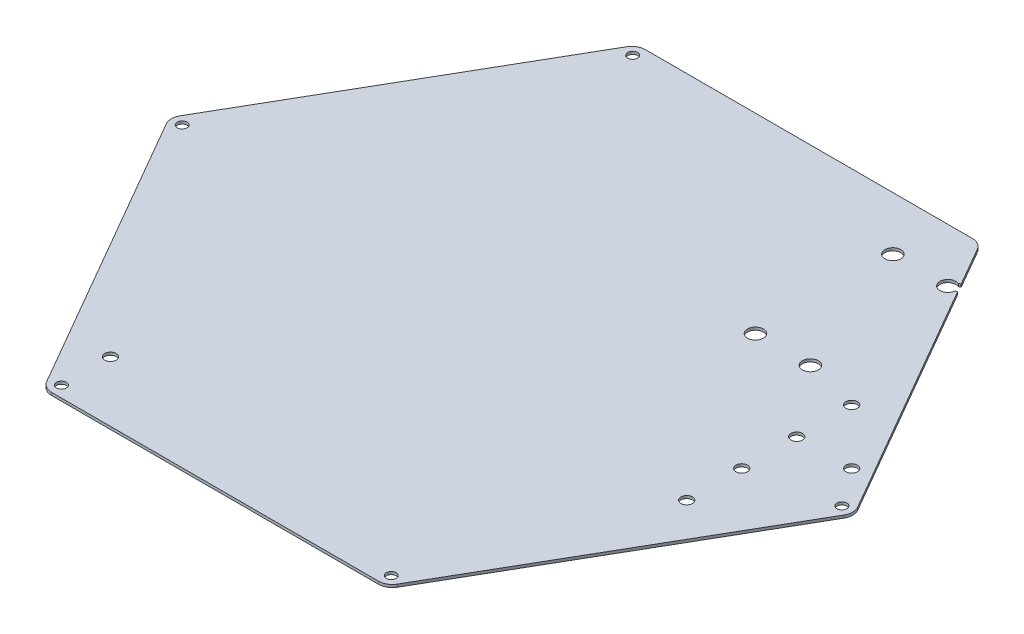
ISO-10303-21;
HEADER;
FILE_DESCRIPTION(('STEP AP214'),'2;1');
FILE_NAME('part.step','',(''),(''),'','','');
FILE_SCHEMA(('AUTOMOTIVE_DESIGN { 1 0 10303 214 1 1 1 1 }'));
ENDSEC;
DATA;
#1=APPLICATION_CONTEXT('core data for automotive mechanical design processes');
#2=APPLICATION_PROTOCOL_DEFINITION('international standard','automotive_design',2000,#1);
#3=PRODUCT_CONTEXT('',#1,'mechanical');
#4=PRODUCT('Part','Part','',(#3));
#5=PRODUCT_RELATED_PRODUCT_CATEGORY('part','',(#4));
#6=PRODUCT_DEFINITION_FORMATION('','',#4);
#7=PRODUCT_DEFINITION_CONTEXT('part definition',#1,'design');
#8=PRODUCT_DEFINITION('design','',#6,#7);
#9=PRODUCT_DEFINITION_SHAPE('','',#8);
#10=(LENGTH_UNIT() NAMED_UNIT(*) SI_UNIT(.MILLI.,.METRE.));
#11=(NAMED_UNIT(*) PLANE_ANGLE_UNIT() SI_UNIT($,.RADIAN.));
#12=(NAMED_UNIT(*) SI_UNIT($,.STERADIAN.) SOLID_ANGLE_UNIT());
#13=UNCERTAINTY_MEASURE_WITH_UNIT(LENGTH_MEASURE(1.E-05),#10,'distance_accuracy_value','');
#14=(GEOMETRIC_REPRESENTATION_CONTEXT(3) GLOBAL_UNCERTAINTY_ASSIGNED_CONTEXT((#13)) GLOBAL_UNIT_ASSIGNED_CONTEXT((#10,
#11,#12)) REPRESENTATION_CONTEXT('',''));
#15=CARTESIAN_POINT('',(0.,0.,0.));
#16=DIRECTION('',(0.,0.,1.));
#17=DIRECTION('',(1.,0.,0.));
#18=AXIS2_PLACEMENT_3D('',#15,#16,#17);
#19=CARTESIAN_POINT('',(249.415316289918,1.,-108.));
#20=DIRECTION('',(-0.866025403784439,0.,0.5));
#21=DIRECTION('',(0.5,0.,0.866025403784439));
#22=AXIS2_PLACEMENT_3D('',#19,#20,#21);
#23=PLANE('',#22);
#24=DIRECTION('',(-0.5,0.,-0.866025403784439));
#25=VECTOR('',#24,1.);
#26=CARTESIAN_POINT('',(249.415316289918,1.,-108.));
#27=LINE('',#26,#25);
#28=CARTESIAN_POINT('',(196.511466747085,1.,-199.632155324167));
#29=VERTEX_POINT('',#28);
#30=CARTESIAN_POINT('',(188.504862890413,1.,-213.5));
#31=VERTEX_POINT('',#30);
#32=EDGE_CURVE('E287',#29,#31,#27,.T.);
#33=ORIENTED_EDGE('',*,*,#32,.F.);
#34=DIRECTION('',(0.,1.,0.));
#35=VECTOR('',#34,1.);
#36=CARTESIAN_POINT('',(196.511466747085,0.,-199.632155324167));
#37=LINE('',#36,#35);
#38=CARTESIAN_POINT('',(196.511466747085,0.,-199.632155324167));
#39=VERTEX_POINT('',#38);
#40=EDGE_CURVE('E173',#39,#29,#37,.T.);
#41=ORIENTED_EDGE('',*,*,#40,.F.);
#42=DIRECTION('',(-0.5,0.,-0.866025403784439));
#43=VECTOR('',#42,1.);
#44=CARTESIAN_POINT('',(249.415316289918,0.,-108.));
#45=LINE('',#44,#43);
#46=CARTESIAN_POINT('',(188.504862890413,0.,-213.5));
#47=VERTEX_POINT('',#46);
#48=EDGE_CURVE('E195',#39,#47,#45,.T.);
#49=ORIENTED_EDGE('',*,*,#48,.T.);
#50=DIRECTION('',(0.,-1.,0.));
#51=VECTOR('',#50,1.);
#52=CARTESIAN_POINT('',(188.504862890413,1.,-213.5));
#53=LINE('',#52,#51);
#54=EDGE_CURVE('E251',#47,#31,#53,.F.);
#55=ORIENTED_EDGE('',*,*,#54,.T.);
#56=EDGE_LOOP('',(#33,#41,#49,#55));
#57=FACE_BOUND('',#56,.T.);
#58=ADVANCED_FACE('F43',(#57),#23,.F.);
#59=CARTESIAN_POINT('',(0.,1.,-108.));
#60=DIRECTION('',(0.866025403784439,0.,-0.5));
#61=DIRECTION('',(-0.5,0.,-0.866025403784439));
#62=AXIS2_PLACEMENT_3D('',#59,#60,#61);
#63=PLANE('',#62);
#64=DIRECTION('',(0.5,0.,0.866025403784439));
#65=VECTOR('',#64,1.);
#66=CARTESIAN_POINT('',(0.,1.,-108.));
#67=LINE('',#66,#65);
#68=CARTESIAN_POINT('',(1.44337567297407,1.,-105.5));
#69=VERTEX_POINT('',#68);
#70=CARTESIAN_POINT('',(60.9104533995055,1.,-2.50000000000002));
#71=VERTEX_POINT('',#70);
#72=EDGE_CURVE('E208',#69,#71,#67,.T.);
#73=ORIENTED_EDGE('',*,*,#72,.F.);
#74=DIRECTION('',(0.,-1.,0.));
#75=VECTOR('',#74,1.);
#76=CARTESIAN_POINT('',(1.44337567297407,1.,-105.5));
#77=LINE('',#76,#75);
#78=CARTESIAN_POINT('',(1.44337567297407,0.,-105.5));
#79=VERTEX_POINT('',#78);
#80=EDGE_CURVE('E211',#69,#79,#77,.T.);
#81=ORIENTED_EDGE('',*,*,#80,.T.);
#82=DIRECTION('',(0.5,0.,0.866025403784439));
#83=VECTOR('',#82,1.);
#84=CARTESIAN_POINT('',(0.,0.,-108.));
#85=LINE('',#84,#83);
#86=CARTESIAN_POINT('',(60.9104533995055,0.,-2.50000000000002));
#87=VERTEX_POINT('',#86);
#88=EDGE_CURVE('E262',#79,#87,#85,.T.);
#89=ORIENTED_EDGE('',*,*,#88,.T.);
#90=DIRECTION('',(0.,-1.,0.));
#91=VECTOR('',#90,1.);
#92=CARTESIAN_POINT('',(60.9104533995055,1.,-2.49999999999997));
#93=LINE('',#92,#91);
#94=EDGE_CURVE('E209',#87,#71,#93,.F.);
#95=ORIENTED_EDGE('',*,*,#94,.T.);
#96=EDGE_LOOP('',(#73,#81,#89,#95));
#97=FACE_BOUND('',#96,.T.);
#98=ADVANCED_FACE('F323',(#97),#63,.F.);
#99=CARTESIAN_POINT('',(62.3538290724796,1.,0.));
#100=DIRECTION('',(0.,0.,-1.));
#101=DIRECTION('',(-1.,0.,0.));
#102=AXIS2_PLACEMENT_3D('',#99,#100,#101);
#103=PLANE('',#102);
#104=DIRECTION('',(1.,0.,0.));
#105=VECTOR('',#104,1.);
#106=CARTESIAN_POINT('',(62.3538290724796,1.,0.));
#107=LINE('',#106,#105);
#108=CARTESIAN_POINT('',(65.2405804184277,1.,0.));
#109=VERTEX_POINT('',#108);
#110=CARTESIAN_POINT('',(184.174735871491,1.,0.));
#111=VERTEX_POINT('',#110);
#112=EDGE_CURVE('E281',#109,#111,#107,.T.);
#113=ORIENTED_EDGE('',*,*,#112,.F.);
#114=DIRECTION('',(0.,-1.,0.));
#115=VECTOR('',#114,1.);
#116=CARTESIAN_POINT('',(65.2405804184277,1.,0.));
#117=LINE('',#116,#115);
#118=CARTESIAN_POINT('',(65.2405804184277,0.,0.));
#119=VERTEX_POINT('',#118);
#120=EDGE_CURVE('E11',#109,#119,#117,.T.);
#121=ORIENTED_EDGE('',*,*,#120,.T.);
#122=DIRECTION('',(1.,0.,0.));
#123=VECTOR('',#122,1.);
#124=CARTESIAN_POINT('',(62.3538290724796,0.,0.));
#125=LINE('',#124,#123);
#126=CARTESIAN_POINT('',(184.174735871491,0.,0.));
#127=VERTEX_POINT('',#126);
#128=EDGE_CURVE('E297',#119,#127,#125,.T.);
#129=ORIENTED_EDGE('',*,*,#128,.T.);
#130=DIRECTION('',(0.,-1.,0.));
#131=VECTOR('',#130,1.);
#132=CARTESIAN_POINT('',(184.174735871491,1.,0.));
#133=LINE('',#132,#131);
#134=EDGE_CURVE('E52',#127,#111,#133,.F.);
#135=ORIENTED_EDGE('',*,*,#134,.T.);
#136=EDGE_LOOP('',(#113,#121,#129,#135));
#137=FACE_BOUND('',#136,.T.);
#138=ADVANCED_FACE('F328',(#137),#103,.F.);
#139=CARTESIAN_POINT('',(187.061487217439,1.,0.));
#140=DIRECTION('',(-0.866025403784439,0.,-0.5));
#141=DIRECTION('',(-0.5,0.,0.866025403784439));
#142=AXIS2_PLACEMENT_3D('',#139,#140,#141);
#143=PLANE('',#142);
#144=DIRECTION('',(0.5,0.,-0.866025403784439));
#145=VECTOR('',#144,1.);
#146=CARTESIAN_POINT('',(187.061487217439,0.,0.));
#147=LINE('',#146,#145);
#148=CARTESIAN_POINT('',(188.504862890413,0.,-2.5));
#149=VERTEX_POINT('',#148);
#150=CARTESIAN_POINT('',(247.971940616944,0.,-105.5));
#151=VERTEX_POINT('',#150);
#152=EDGE_CURVE('E202',#149,#151,#147,.T.);
#153=ORIENTED_EDGE('',*,*,#152,.T.);
#154=DIRECTION('',(0.,-1.,0.));
#155=VECTOR('',#154,1.);
#156=CARTESIAN_POINT('',(247.971940616944,1.,-105.5));
#157=LINE('',#156,#155);
#158=CARTESIAN_POINT('',(247.971940616944,1.,-105.5));
#159=VERTEX_POINT('',#158);
#160=EDGE_CURVE('E257',#151,#159,#157,.F.);
#161=ORIENTED_EDGE('',*,*,#160,.T.);
#162=DIRECTION('',(0.5,0.,-0.866025403784439));
#163=VECTOR('',#162,1.);
#164=CARTESIAN_POINT('',(187.061487217439,1.,0.));
#165=LINE('',#164,#163);
#166=CARTESIAN_POINT('',(188.504862890413,1.,-2.5));
#167=VERTEX_POINT('',#166);
#168=EDGE_CURVE('E284',#167,#159,#165,.T.);
#169=ORIENTED_EDGE('',*,*,#168,.F.);
#170=DIRECTION('',(0.,-1.,0.));
#171=VECTOR('',#170,1.);
#172=CARTESIAN_POINT('',(188.504862890413,1.,-2.5));
#173=LINE('',#172,#171);
#174=EDGE_CURVE('E254',#167,#149,#173,.T.);
#175=ORIENTED_EDGE('',*,*,#174,.T.);
#176=EDGE_LOOP('',(#153,#161,#169,#175));
#177=FACE_BOUND('',#176,.T.);
#178=ADVANCED_FACE('F306',(#177),#143,.F.);
#179=CARTESIAN_POINT('',(247.971940616944,0.,-110.5));
#180=VERTEX_POINT('',#179);
#181=CARTESIAN_POINT('',(198.261466747085,0.,-196.601066410922));
#182=VERTEX_POINT('',#181);
#183=EDGE_CURVE('E182',#180,#182,#45,.T.);
#184=ORIENTED_EDGE('',*,*,#183,.T.);
#185=DIRECTION('',(0.,1.,0.));
#186=VECTOR('',#185,1.);
#187=CARTESIAN_POINT('',(198.261466747085,0.,-196.601066410922));
#188=LINE('',#187,#186);
#189=CARTESIAN_POINT('',(198.261466747085,1.,-196.601066410922));
#190=VERTEX_POINT('',#189);
#191=EDGE_CURVE('E164',#182,#190,#188,.T.);
#192=ORIENTED_EDGE('',*,*,#191,.T.);
#193=CARTESIAN_POINT('',(247.971940616944,1.,-110.5));
#194=VERTEX_POINT('',#193);
#195=EDGE_CURVE('E288',#194,#190,#27,.T.);
#196=ORIENTED_EDGE('',*,*,#195,.F.);
#197=DIRECTION('',(0.,-1.,0.));
#198=VECTOR('',#197,1.);
#199=CARTESIAN_POINT('',(247.971940616944,1.,-110.5));
#200=LINE('',#199,#198);
#201=EDGE_CURVE('E192',#194,#180,#200,.T.);
#202=ORIENTED_EDGE('',*,*,#201,.T.);
#203=EDGE_LOOP('',(#184,#192,#196,#202));
#204=FACE_BOUND('',#203,.T.);
#205=ADVANCED_FACE('F190',(#204),#23,.F.);
#206=CARTESIAN_POINT('',(187.061487217439,1.,-216.));
#207=DIRECTION('',(0.,0.,1.));
#208=DIRECTION('',(1.,0.,0.));
#209=AXIS2_PLACEMENT_3D('',#206,#207,#208);
#210=PLANE('',#209);
#211=DIRECTION('',(-1.,0.,0.));
#212=VECTOR('',#211,1.);
#213=CARTESIAN_POINT('',(187.061487217439,0.,-216.));
#214=LINE('',#213,#212);
#215=CARTESIAN_POINT('',(184.174735871491,0.,-216.));
#216=VERTEX_POINT('',#215);
#217=CARTESIAN_POINT('',(65.2405804184277,0.,-216.));
#218=VERTEX_POINT('',#217);
#219=EDGE_CURVE('E194',#216,#218,#214,.T.);
#220=ORIENTED_EDGE('',*,*,#219,.T.);
#221=DIRECTION('',(0.,-1.,0.));
#222=VECTOR('',#221,1.);
#223=CARTESIAN_POINT('',(65.2405804184277,1.,-216.));
#224=LINE('',#223,#222);
#225=CARTESIAN_POINT('',(65.2405804184277,1.,-216.));
#226=VERTEX_POINT('',#225);
#227=EDGE_CURVE('E248',#218,#226,#224,.F.);
#228=ORIENTED_EDGE('',*,*,#227,.T.);
#229=DIRECTION('',(-1.,0.,0.));
#230=VECTOR('',#229,1.);
#231=CARTESIAN_POINT('',(187.061487217439,1.,-216.));
#232=LINE('',#231,#230);
#233=CARTESIAN_POINT('',(184.174735871491,1.,-216.));
#234=VERTEX_POINT('',#233);
#235=EDGE_CURVE('E291',#234,#226,#232,.T.);
#236=ORIENTED_EDGE('',*,*,#235,.F.);
#237=DIRECTION('',(0.,-1.,0.));
#238=VECTOR('',#237,1.);
#239=CARTESIAN_POINT('',(184.174735871491,1.,-216.));
#240=LINE('',#239,#238);
#241=EDGE_CURVE('E245',#234,#216,#240,.T.);
#242=ORIENTED_EDGE('',*,*,#241,.T.);
#243=EDGE_LOOP('',(#220,#228,#236,#242));
#244=FACE_BOUND('',#243,.T.);
#245=ADVANCED_FACE('F345',(#244),#210,.F.);
#246=CARTESIAN_POINT('',(62.3538290724795,1.,-216.));
#247=DIRECTION('',(0.866025403784439,0.,0.5));
#248=DIRECTION('',(0.5,0.,-0.866025403784439));
#249=AXIS2_PLACEMENT_3D('',#246,#247,#248);
#250=PLANE('',#249);
#251=DIRECTION('',(-0.5,0.,0.866025403784439));
#252=VECTOR('',#251,1.);
#253=CARTESIAN_POINT('',(62.3538290724795,0.,-216.));
#254=LINE('',#253,#252);
#255=CARTESIAN_POINT('',(60.9104533995055,0.,-213.5));
#256=VERTEX_POINT('',#255);
#257=CARTESIAN_POINT('',(1.44337567297408,0.,-110.5));
#258=VERTEX_POINT('',#257);
#259=EDGE_CURVE('E199',#256,#258,#254,.T.);
#260=ORIENTED_EDGE('',*,*,#259,.T.);
#261=DIRECTION('',(0.,-1.,0.));
#262=VECTOR('',#261,1.);
#263=CARTESIAN_POINT('',(1.44337567297408,1.,-110.5));
#264=LINE('',#263,#262);
#265=CARTESIAN_POINT('',(1.44337567297408,1.,-110.5));
#266=VERTEX_POINT('',#265);
#267=EDGE_CURVE('E231',#258,#266,#264,.F.);
#268=ORIENTED_EDGE('',*,*,#267,.T.);
#269=DIRECTION('',(-0.5,0.,0.866025403784439));
#270=VECTOR('',#269,1.);
#271=CARTESIAN_POINT('',(62.3538290724795,1.,-216.));
#272=LINE('',#271,#270);
#273=CARTESIAN_POINT('',(60.9104533995055,1.,-213.5));
#274=VERTEX_POINT('',#273);
#275=EDGE_CURVE('E212',#274,#266,#272,.T.);
#276=ORIENTED_EDGE('',*,*,#275,.F.);
#277=DIRECTION('',(0.,-1.,0.));
#278=VECTOR('',#277,1.);
#279=CARTESIAN_POINT('',(60.9104533995055,1.,-213.5));
#280=LINE('',#279,#278);
#281=EDGE_CURVE('E228',#274,#256,#280,.T.);
#282=ORIENTED_EDGE('',*,*,#281,.T.);
#283=EDGE_LOOP('',(#260,#268,#276,#282));
#284=FACE_BOUND('',#283,.T.);
#285=ADVANCED_FACE('F349',(#284),#250,.F.);
#286=CARTESIAN_POINT('',(0.,1.,0.));
#287=DIRECTION('',(0.,1.,0.));
#288=DIRECTION('',(0.,0.,1.));
#289=AXIS2_PLACEMENT_3D('',#286,#287,#288);
#290=PLANE('',#289);
#291=CARTESIAN_POINT('',(234.707658144959,1.,-121.57));
#292=DIRECTION('',(0.,1.,0.));
#293=DIRECTION('',(0.,0.,1.));
#294=AXIS2_PLACEMENT_3D('',#291,#292,#293);
#295=CIRCLE('',#294,2.10000000000002);
#296=CARTESIAN_POINT('',(234.707658144959,1.,-119.47));
#297=VERTEX_POINT('',#296);
#298=EDGE_CURVE('E435',#297,#297,#295,.T.);
#299=ORIENTED_EDGE('',*,*,#298,.F.);
#300=EDGE_LOOP('',(#299));
#301=FACE_BOUND('',#300,.T.);
#302=CARTESIAN_POINT('',(214.707658144959,1.,-81.57));
#303=DIRECTION('',(0.,1.,0.));
#304=DIRECTION('',(0.,0.,1.));
#305=AXIS2_PLACEMENT_3D('',#302,#303,#304);
#306=CIRCLE('',#305,2.10000000000002);
#307=CARTESIAN_POINT('',(214.707658144959,1.,-79.47));
#308=VERTEX_POINT('',#307);
#309=EDGE_CURVE('E437',#308,#308,#306,.T.);
#310=ORIENTED_EDGE('',*,*,#309,.F.);
#311=EDGE_LOOP('',(#310));
#312=FACE_BOUND('',#311,.T.);
#313=CARTESIAN_POINT('',(214.707658144959,1.,-101.57));
#314=DIRECTION('',(0.,1.,0.));
#315=DIRECTION('',(0.,0.,1.));
#316=AXIS2_PLACEMENT_3D('',#313,#314,#315);
#317=CIRCLE('',#316,2.09999999999999);
#318=CARTESIAN_POINT('',(214.707658144959,1.,-99.47));
#319=VERTEX_POINT('',#318);
#320=EDGE_CURVE('E443',#319,#319,#317,.T.);
#321=ORIENTED_EDGE('',*,*,#320,.F.);
#322=EDGE_LOOP('',(#321));
#323=FACE_BOUND('',#322,.T.);
#324=CARTESIAN_POINT('',(214.707658144959,1.,-121.57));
#325=DIRECTION('',(0.,1.,0.));
#326=DIRECTION('',(0.,0.,1.));
#327=AXIS2_PLACEMENT_3D('',#324,#325,#326);
#328=CIRCLE('',#327,2.09999999999999);
#329=CARTESIAN_POINT('',(214.707658144959,1.,-119.47));
#330=VERTEX_POINT('',#329);
#331=EDGE_CURVE('E449',#330,#330,#328,.T.);
#332=ORIENTED_EDGE('',*,*,#331,.F.);
#333=EDGE_LOOP('',(#332));
#334=FACE_BOUND('',#333,.T.);
#335=CARTESIAN_POINT('',(214.707658144959,1.,-141.57));
#336=DIRECTION('',(0.,1.,0.));
#337=DIRECTION('',(0.,0.,1.));
#338=AXIS2_PLACEMENT_3D('',#335,#336,#337);
#339=CIRCLE('',#338,2.09999999999999);
#340=CARTESIAN_POINT('',(214.707658144959,1.,-139.47));
#341=VERTEX_POINT('',#340);
#342=EDGE_CURVE('E455',#341,#341,#339,.T.);
#343=ORIENTED_EDGE('',*,*,#342,.F.);
#344=EDGE_LOOP('',(#343));
#345=FACE_BOUND('',#344,.T.);
#346=CARTESIAN_POINT('',(64.7076581449591,1.,-21.9230484541327));
#347=DIRECTION('',(0.,1.,0.));
#348=DIRECTION('',(0.,0.,1.));
#349=AXIS2_PLACEMENT_3D('',#346,#347,#348);
#350=CIRCLE('',#349,2.1);
#351=CARTESIAN_POINT('',(64.7076581449591,1.,-19.8230484541327));
#352=VERTEX_POINT('',#351);
#353=EDGE_CURVE('E461',#352,#352,#350,.T.);
#354=ORIENTED_EDGE('',*,*,#353,.F.);
#355=EDGE_LOOP('',(#354));
#356=FACE_BOUND('',#355,.T.);
#357=DIRECTION('',(-0.866025403784455,0.,0.499999999999972));
#358=VECTOR('',#357,1.);
#359=CARTESIAN_POINT('',(195.835312633382,1.,-199.241777564608));
#360=LINE('',#359,#358);
#361=CARTESIAN_POINT('',(195.835312633382,1.,-199.241777564608));
#362=VERTEX_POINT('',#361);
#363=EDGE_CURVE('E73',#29,#362,#360,.T.);
#364=ORIENTED_EDGE('',*,*,#363,.F.);
#365=ORIENTED_EDGE('',*,*,#32,.T.);
#366=CARTESIAN_POINT('',(184.174735871491,1.,-211.));
#367=DIRECTION('',(0.,1.,0.));
#368=DIRECTION('',(0.,0.,1.));
#369=AXIS2_PLACEMENT_3D('',#366,#367,#368);
#370=CIRCLE('',#369,5.);
#371=EDGE_CURVE('E239',#31,#234,#370,.T.);
#372=ORIENTED_EDGE('',*,*,#371,.T.);
#373=ORIENTED_EDGE('',*,*,#235,.T.);
#374=CARTESIAN_POINT('',(65.2405804184277,1.,-211.));
#375=DIRECTION('',(0.,1.,0.));
#376=DIRECTION('',(0.,0.,1.));
#377=AXIS2_PLACEMENT_3D('',#374,#375,#376);
#378=CIRCLE('',#377,5.);
#379=EDGE_CURVE('E241',#226,#274,#378,.T.);
#380=ORIENTED_EDGE('',*,*,#379,.T.);
#381=ORIENTED_EDGE('',*,*,#275,.T.);
#382=CARTESIAN_POINT('',(5.77350269189626,1.,-108.));
#383=DIRECTION('',(0.,1.,0.));
#384=DIRECTION('',(0.,0.,1.));
#385=AXIS2_PLACEMENT_3D('',#382,#383,#384);
#386=CIRCLE('',#385,5.);
#387=EDGE_CURVE('E243',#266,#69,#386,.T.);
#388=ORIENTED_EDGE('',*,*,#387,.T.);
#389=ORIENTED_EDGE('',*,*,#72,.T.);
#390=CARTESIAN_POINT('',(65.2405804184277,1.,-5.));
#391=DIRECTION('',(0.,1.,0.));
#392=DIRECTION('',(0.,0.,1.));
#393=AXIS2_PLACEMENT_3D('',#390,#391,#392);
#394=CIRCLE('',#393,5.);
#395=EDGE_CURVE('E235',#71,#109,#394,.T.);
#396=ORIENTED_EDGE('',*,*,#395,.T.);
#397=ORIENTED_EDGE('',*,*,#112,.T.);
#398=CARTESIAN_POINT('',(184.174735871491,1.,-5.));
#399=DIRECTION('',(0.,1.,0.));
#400=DIRECTION('',(0.,0.,1.));
#401=AXIS2_PLACEMENT_3D('',#398,#399,#400);
#402=CIRCLE('',#401,5.);
#403=EDGE_CURVE('E233',#111,#167,#402,.T.);
#404=ORIENTED_EDGE('',*,*,#403,.T.);
#405=ORIENTED_EDGE('',*,*,#168,.T.);
#406=CARTESIAN_POINT('',(243.641813598022,1.,-108.));
#407=DIRECTION('',(0.,1.,0.));
#408=DIRECTION('',(0.,0.,1.));
#409=AXIS2_PLACEMENT_3D('',#406,#407,#408);
#410=CIRCLE('',#409,5.);
#411=EDGE_CURVE('E237',#159,#194,#410,.T.);
#412=ORIENTED_EDGE('',*,*,#411,.T.);
#413=ORIENTED_EDGE('',*,*,#195,.T.);
#414=DIRECTION('',(0.866025403784464,0.,-0.499999999999956));
#415=VECTOR('',#414,1.);
#416=CARTESIAN_POINT('',(197.585312633382,1.,-196.210688651362));
#417=LINE('',#416,#415);
#418=CARTESIAN_POINT('',(197.585312633382,1.,-196.210688651362));
#419=VERTEX_POINT('',#418);
#420=EDGE_CURVE('E167',#419,#190,#417,.T.);
#421=ORIENTED_EDGE('',*,*,#420,.F.);
#422=CARTESIAN_POINT('',(194.707658144959,1.,-196.57));
#423=DIRECTION('',(0.,1.,0.));
#424=DIRECTION('',(0.,0.,1.));
#425=AXIS2_PLACEMENT_3D('',#422,#423,#424);
#426=CIRCLE('',#425,2.89999999999999);
#427=EDGE_CURVE('E265',#362,#419,#426,.T.);
#428=ORIENTED_EDGE('',*,*,#427,.F.);
#429=EDGE_LOOP('',(#364,#365,#372,#373,#380,#381,#388,#389,#396,#397,#404,#405,#412,#413,#421,#428));
#430=FACE_BOUND('',#429,.T.);
#431=CARTESIAN_POINT('',(4.70765814495913,1.,-108.));
#432=DIRECTION('',(0.,1.,0.));
#433=DIRECTION('',(0.,0.,1.));
#434=AXIS2_PLACEMENT_3D('',#431,#432,#433);
#435=CIRCLE('',#434,1.8);
#436=CARTESIAN_POINT('',(4.70765814495913,1.,-106.2));
#437=VERTEX_POINT('',#436);
#438=EDGE_CURVE('E476',#437,#437,#435,.T.);
#439=ORIENTED_EDGE('',*,*,#438,.F.);
#440=EDGE_LOOP('',(#439));
#441=FACE_BOUND('',#440,.T.);
#442=CARTESIAN_POINT('',(64.7076581449594,1.,-211.923048454133));
#443=DIRECTION('',(0.,1.,0.));
#444=DIRECTION('',(0.,0.,1.));
#445=AXIS2_PLACEMENT_3D('',#442,#443,#444);
#446=CIRCLE('',#445,1.8);
#447=CARTESIAN_POINT('',(64.7076581449594,1.,-210.123048454133));
#448=VERTEX_POINT('',#447);
#449=EDGE_CURVE('E486',#448,#448,#446,.T.);
#450=ORIENTED_EDGE('',*,*,#449,.F.);
#451=EDGE_LOOP('',(#450));
#452=FACE_BOUND('',#451,.T.);
#453=CARTESIAN_POINT('',(244.707658144959,1.,-108.));
#454=DIRECTION('',(0.,1.,0.));
#455=DIRECTION('',(0.,0.,1.));
#456=AXIS2_PLACEMENT_3D('',#453,#454,#455);
#457=CIRCLE('',#456,1.8);
#458=CARTESIAN_POINT('',(244.707658144959,1.,-106.2));
#459=VERTEX_POINT('',#458);
#460=EDGE_CURVE('E492',#459,#459,#457,.T.);
#461=ORIENTED_EDGE('',*,*,#460,.F.);
#462=EDGE_LOOP('',(#461));
#463=FACE_BOUND('',#462,.T.);
#464=CARTESIAN_POINT('',(184.707658144959,1.,-4.07695154586725));
#465=DIRECTION('',(0.,1.,0.));
#466=DIRECTION('',(0.,0.,1.));
#467=AXIS2_PLACEMENT_3D('',#464,#465,#466);
#468=CIRCLE('',#467,1.8);
#469=CARTESIAN_POINT('',(184.707658144959,1.,-2.27695154586725));
#470=VERTEX_POINT('',#469);
#471=EDGE_CURVE('E498',#470,#470,#468,.T.);
#472=ORIENTED_EDGE('',*,*,#471,.F.);
#473=EDGE_LOOP('',(#472));
#474=FACE_BOUND('',#473,.T.);
#475=CARTESIAN_POINT('',(64.7076581449587,1.,-4.07695154586763));
#476=DIRECTION('',(0.,1.,0.));
#477=DIRECTION('',(0.,0.,1.));
#478=AXIS2_PLACEMENT_3D('',#475,#476,#477);
#479=CIRCLE('',#478,1.8);
#480=CARTESIAN_POINT('',(64.7076581449587,1.,-2.27695154586763));
#481=VERTEX_POINT('',#480);
#482=EDGE_CURVE('E504',#481,#481,#479,.T.);
#483=ORIENTED_EDGE('',*,*,#482,.F.);
#484=EDGE_LOOP('',(#483));
#485=FACE_BOUND('',#484,.T.);
#486=CARTESIAN_POINT('',(174.707658144959,1.,-146.57));
#487=DIRECTION('',(0.,1.,0.));
#488=DIRECTION('',(0.,0.,1.));
#489=AXIS2_PLACEMENT_3D('',#486,#487,#488);
#490=CIRCLE('',#489,2.89999999999999);
#491=CARTESIAN_POINT('',(174.707658144959,1.,-143.67));
#492=VERTEX_POINT('',#491);
#493=EDGE_CURVE('E510',#492,#492,#490,.T.);
#494=ORIENTED_EDGE('',*,*,#493,.F.);
#495=EDGE_LOOP('',(#494));
#496=FACE_BOUND('',#495,.T.);
#497=CARTESIAN_POINT('',(194.707658144959,1.,-146.57));
#498=DIRECTION('',(0.,1.,0.));
#499=DIRECTION('',(0.,0.,1.));
#500=AXIS2_PLACEMENT_3D('',#497,#498,#499);
#501=CIRCLE('',#500,2.89999999999999);
#502=CARTESIAN_POINT('',(194.707658144959,1.,-143.67));
#503=VERTEX_POINT('',#502);
#504=EDGE_CURVE('E275',#503,#503,#501,.T.);
#505=ORIENTED_EDGE('',*,*,#504,.F.);
#506=EDGE_LOOP('',(#505));
#507=FACE_BOUND('',#506,.T.);
#508=CARTESIAN_POINT('',(174.707658144959,1.,-196.57));
#509=DIRECTION('',(0.,1.,0.));
#510=DIRECTION('',(0.,0.,1.));
#511=AXIS2_PLACEMENT_3D('',#508,#509,#510);
#512=CIRCLE('',#511,2.89999999999999);
#513=CARTESIAN_POINT('',(174.707658144959,1.,-193.67));
#514=VERTEX_POINT('',#513);
#515=EDGE_CURVE('E263',#514,#514,#512,.T.);
#516=ORIENTED_EDGE('',*,*,#515,.F.);
#517=EDGE_LOOP('',(#516));
#518=FACE_BOUND('',#517,.T.);
#519=ADVANCED_FACE('F313',(#301,#312,#323,#334,#345,#356,#430,#441,#452,#463,#474,#485,#496,
#507,#518),#290,.T.);
#520=CARTESIAN_POINT('',(0.,0.,0.));
#521=DIRECTION('',(0.,1.,0.));
#522=DIRECTION('',(0.,0.,1.));
#523=AXIS2_PLACEMENT_3D('',#520,#521,#522);
#524=PLANE('',#523);
#525=CARTESIAN_POINT('',(234.707658144959,0.,-121.57));
#526=DIRECTION('',(0.,1.,0.));
#527=DIRECTION('',(0.,0.,1.));
#528=AXIS2_PLACEMENT_3D('',#525,#526,#527);
#529=CIRCLE('',#528,2.10000000000002);
#530=CARTESIAN_POINT('',(234.707658144959,0.,-119.47));
#531=VERTEX_POINT('',#530);
#532=EDGE_CURVE('E432',#531,#531,#529,.T.);
#533=ORIENTED_EDGE('',*,*,#532,.T.);
#534=EDGE_LOOP('',(#533));
#535=FACE_BOUND('',#534,.T.);
#536=CARTESIAN_POINT('',(214.707658144959,0.,-81.57));
#537=DIRECTION('',(0.,1.,0.));
#538=DIRECTION('',(0.,0.,1.));
#539=AXIS2_PLACEMENT_3D('',#536,#537,#538);
#540=CIRCLE('',#539,2.10000000000002);
#541=CARTESIAN_POINT('',(214.707658144959,0.,-79.47));
#542=VERTEX_POINT('',#541);
#543=EDGE_CURVE('E440',#542,#542,#540,.T.);
#544=ORIENTED_EDGE('',*,*,#543,.T.);
#545=EDGE_LOOP('',(#544));
#546=FACE_BOUND('',#545,.T.);
#547=CARTESIAN_POINT('',(214.707658144959,0.,-101.57));
#548=DIRECTION('',(0.,1.,0.));
#549=DIRECTION('',(0.,0.,1.));
#550=AXIS2_PLACEMENT_3D('',#547,#548,#549);
#551=CIRCLE('',#550,2.09999999999999);
#552=CARTESIAN_POINT('',(214.707658144959,0.,-99.47));
#553=VERTEX_POINT('',#552);
#554=EDGE_CURVE('E446',#553,#553,#551,.T.);
#555=ORIENTED_EDGE('',*,*,#554,.T.);
#556=EDGE_LOOP('',(#555));
#557=FACE_BOUND('',#556,.T.);
#558=CARTESIAN_POINT('',(214.707658144959,0.,-121.57));
#559=DIRECTION('',(0.,1.,0.));
#560=DIRECTION('',(0.,0.,1.));
#561=AXIS2_PLACEMENT_3D('',#558,#559,#560);
#562=CIRCLE('',#561,2.09999999999999);
#563=CARTESIAN_POINT('',(214.707658144959,0.,-119.47));
#564=VERTEX_POINT('',#563);
#565=EDGE_CURVE('E452',#564,#564,#562,.T.);
#566=ORIENTED_EDGE('',*,*,#565,.T.);
#567=EDGE_LOOP('',(#566));
#568=FACE_BOUND('',#567,.T.);
#569=CARTESIAN_POINT('',(214.707658144959,0.,-141.57));
#570=DIRECTION('',(0.,1.,0.));
#571=DIRECTION('',(0.,0.,1.));
#572=AXIS2_PLACEMENT_3D('',#569,#570,#571);
#573=CIRCLE('',#572,2.09999999999999);
#574=CARTESIAN_POINT('',(214.707658144959,0.,-139.47));
#575=VERTEX_POINT('',#574);
#576=EDGE_CURVE('E458',#575,#575,#573,.T.);
#577=ORIENTED_EDGE('',*,*,#576,.T.);
#578=EDGE_LOOP('',(#577));
#579=FACE_BOUND('',#578,.T.);
#580=CARTESIAN_POINT('',(64.7076581449591,0.,-21.9230484541327));
#581=DIRECTION('',(0.,1.,0.));
#582=DIRECTION('',(0.,0.,1.));
#583=AXIS2_PLACEMENT_3D('',#580,#581,#582);
#584=CIRCLE('',#583,2.1);
#585=CARTESIAN_POINT('',(64.7076581449591,0.,-19.8230484541327));
#586=VERTEX_POINT('',#585);
#587=EDGE_CURVE('E464',#586,#586,#584,.T.);
#588=ORIENTED_EDGE('',*,*,#587,.T.);
#589=EDGE_LOOP('',(#588));
#590=FACE_BOUND('',#589,.T.);
#591=CARTESIAN_POINT('',(4.70765814495913,0.,-108.));
#592=DIRECTION('',(0.,1.,0.));
#593=DIRECTION('',(0.,0.,1.));
#594=AXIS2_PLACEMENT_3D('',#591,#592,#593);
#595=CIRCLE('',#594,1.8);
#596=CARTESIAN_POINT('',(4.70765814495913,0.,-106.2));
#597=VERTEX_POINT('',#596);
#598=EDGE_CURVE('E483',#597,#597,#595,.T.);
#599=ORIENTED_EDGE('',*,*,#598,.T.);
#600=EDGE_LOOP('',(#599));
#601=FACE_BOUND('',#600,.T.);
#602=CARTESIAN_POINT('',(64.7076581449594,0.,-211.923048454133));
#603=DIRECTION('',(0.,1.,0.));
#604=DIRECTION('',(0.,0.,1.));
#605=AXIS2_PLACEMENT_3D('',#602,#603,#604);
#606=CIRCLE('',#605,1.8);
#607=CARTESIAN_POINT('',(64.7076581449594,0.,-210.123048454133));
#608=VERTEX_POINT('',#607);
#609=EDGE_CURVE('E489',#608,#608,#606,.T.);
#610=ORIENTED_EDGE('',*,*,#609,.T.);
#611=EDGE_LOOP('',(#610));
#612=FACE_BOUND('',#611,.T.);
#613=CARTESIAN_POINT('',(244.707658144959,0.,-108.));
#614=DIRECTION('',(0.,1.,0.));
#615=DIRECTION('',(0.,0.,1.));
#616=AXIS2_PLACEMENT_3D('',#613,#614,#615);
#617=CIRCLE('',#616,1.8);
#618=CARTESIAN_POINT('',(244.707658144959,0.,-106.2));
#619=VERTEX_POINT('',#618);
#620=EDGE_CURVE('E495',#619,#619,#617,.T.);
#621=ORIENTED_EDGE('',*,*,#620,.T.);
#622=EDGE_LOOP('',(#621));
#623=FACE_BOUND('',#622,.T.);
#624=CARTESIAN_POINT('',(184.707658144959,0.,-4.07695154586725));
#625=DIRECTION('',(0.,1.,0.));
#626=DIRECTION('',(0.,0.,1.));
#627=AXIS2_PLACEMENT_3D('',#624,#625,#626);
#628=CIRCLE('',#627,1.8);
#629=CARTESIAN_POINT('',(184.707658144959,0.,-2.27695154586725));
#630=VERTEX_POINT('',#629);
#631=EDGE_CURVE('E501',#630,#630,#628,.T.);
#632=ORIENTED_EDGE('',*,*,#631,.T.);
#633=EDGE_LOOP('',(#632));
#634=FACE_BOUND('',#633,.T.);
#635=CARTESIAN_POINT('',(64.7076581449587,0.,-4.07695154586763));
#636=DIRECTION('',(0.,1.,0.));
#637=DIRECTION('',(0.,0.,1.));
#638=AXIS2_PLACEMENT_3D('',#635,#636,#637);
#639=CIRCLE('',#638,1.8);
#640=CARTESIAN_POINT('',(64.7076581449587,0.,-2.27695154586763));
#641=VERTEX_POINT('',#640);
#642=EDGE_CURVE('E507',#641,#641,#639,.T.);
#643=ORIENTED_EDGE('',*,*,#642,.T.);
#644=EDGE_LOOP('',(#643));
#645=FACE_BOUND('',#644,.T.);
#646=CARTESIAN_POINT('',(174.707658144959,0.,-146.57));
#647=DIRECTION('',(0.,1.,0.));
#648=DIRECTION('',(0.,0.,1.));
#649=AXIS2_PLACEMENT_3D('',#646,#647,#648);
#650=CIRCLE('',#649,2.89999999999999);
#651=CARTESIAN_POINT('',(174.707658144959,0.,-143.67));
#652=VERTEX_POINT('',#651);
#653=EDGE_CURVE('E512',#652,#652,#650,.T.);
#654=ORIENTED_EDGE('',*,*,#653,.T.);
#655=EDGE_LOOP('',(#654));
#656=FACE_BOUND('',#655,.T.);
#657=CARTESIAN_POINT('',(194.707658144959,0.,-146.57));
#658=DIRECTION('',(0.,1.,0.));
#659=DIRECTION('',(0.,0.,1.));
#660=AXIS2_PLACEMENT_3D('',#657,#658,#659);
#661=CIRCLE('',#660,2.89999999999999);
#662=CARTESIAN_POINT('',(194.707658144959,0.,-143.67));
#663=VERTEX_POINT('',#662);
#664=EDGE_CURVE('E47',#663,#663,#661,.T.);
#665=ORIENTED_EDGE('',*,*,#664,.T.);
#666=EDGE_LOOP('',(#665));
#667=FACE_BOUND('',#666,.T.);
#668=ORIENTED_EDGE('',*,*,#48,.F.);
#669=DIRECTION('',(-0.866025403784455,0.,0.499999999999972));
#670=VECTOR('',#669,1.);
#671=CARTESIAN_POINT('',(195.835312633382,0.,-199.241777564608));
#672=LINE('',#671,#670);
#673=CARTESIAN_POINT('',(195.835312633382,0.,-199.241777564608));
#674=VERTEX_POINT('',#673);
#675=EDGE_CURVE('E187',#39,#674,#672,.T.);
#676=ORIENTED_EDGE('',*,*,#675,.T.);
#677=CARTESIAN_POINT('',(194.707658144959,0.,-196.57));
#678=DIRECTION('',(0.,1.,0.));
#679=DIRECTION('',(0.,0.,1.));
#680=AXIS2_PLACEMENT_3D('',#677,#678,#679);
#681=CIRCLE('',#680,2.89999999999999);
#682=CARTESIAN_POINT('',(197.585312633382,0.,-196.210688651362));
#683=VERTEX_POINT('',#682);
#684=EDGE_CURVE('E185',#674,#683,#681,.T.);
#685=ORIENTED_EDGE('',*,*,#684,.T.);
#686=DIRECTION('',(0.866025403784464,0.,-0.499999999999956));
#687=VECTOR('',#686,1.);
#688=CARTESIAN_POINT('',(197.585312633382,0.,-196.210688651362));
#689=LINE('',#688,#687);
#690=EDGE_CURVE('E63',#683,#182,#689,.T.);
#691=ORIENTED_EDGE('',*,*,#690,.T.);
#692=ORIENTED_EDGE('',*,*,#183,.F.);
#693=CARTESIAN_POINT('',(243.641813598022,0.,-108.));
#694=DIRECTION('',(0.,1.,0.));
#695=DIRECTION('',(0.,0.,1.));
#696=AXIS2_PLACEMENT_3D('',#693,#694,#695);
#697=CIRCLE('',#696,5.);
#698=EDGE_CURVE('E219',#180,#151,#697,.F.);
#699=ORIENTED_EDGE('',*,*,#698,.T.);
#700=ORIENTED_EDGE('',*,*,#152,.F.);
#701=CARTESIAN_POINT('',(184.174735871491,0.,-5.));
#702=DIRECTION('',(0.,1.,0.));
#703=DIRECTION('',(0.,0.,1.));
#704=AXIS2_PLACEMENT_3D('',#701,#702,#703);
#705=CIRCLE('',#704,5.);
#706=EDGE_CURVE('E215',#149,#127,#705,.F.);
#707=ORIENTED_EDGE('',*,*,#706,.T.);
#708=ORIENTED_EDGE('',*,*,#128,.F.);
#709=CARTESIAN_POINT('',(65.2405804184277,0.,-5.));
#710=DIRECTION('',(0.,1.,0.));
#711=DIRECTION('',(0.,0.,1.));
#712=AXIS2_PLACEMENT_3D('',#709,#710,#711);
#713=CIRCLE('',#712,5.);
#714=EDGE_CURVE('E217',#119,#87,#713,.F.);
#715=ORIENTED_EDGE('',*,*,#714,.T.);
#716=ORIENTED_EDGE('',*,*,#88,.F.);
#717=CARTESIAN_POINT('',(5.77350269189626,0.,-108.));
#718=DIRECTION('',(0.,1.,0.));
#719=DIRECTION('',(0.,0.,1.));
#720=AXIS2_PLACEMENT_3D('',#717,#718,#719);
#721=CIRCLE('',#720,5.);
#722=EDGE_CURVE('E226',#79,#258,#721,.F.);
#723=ORIENTED_EDGE('',*,*,#722,.T.);
#724=ORIENTED_EDGE('',*,*,#259,.F.);
#725=CARTESIAN_POINT('',(65.2405804184277,0.,-211.));
#726=DIRECTION('',(0.,1.,0.));
#727=DIRECTION('',(0.,0.,1.));
#728=AXIS2_PLACEMENT_3D('',#725,#726,#727);
#729=CIRCLE('',#728,5.);
#730=EDGE_CURVE('E224',#256,#218,#729,.F.);
#731=ORIENTED_EDGE('',*,*,#730,.T.);
#732=ORIENTED_EDGE('',*,*,#219,.F.);
#733=CARTESIAN_POINT('',(184.174735871491,0.,-211.));
#734=DIRECTION('',(0.,1.,0.));
#735=DIRECTION('',(0.,0.,1.));
#736=AXIS2_PLACEMENT_3D('',#733,#734,#735);
#737=CIRCLE('',#736,5.);
#738=EDGE_CURVE('E221',#216,#47,#737,.F.);
#739=ORIENTED_EDGE('',*,*,#738,.T.);
#740=EDGE_LOOP('',(#668,#676,#685,#691,#692,#699,#700,#707,#708,#715,#716,#723,#724,#731,#732,#739));
#741=FACE_BOUND('',#740,.T.);
#742=CARTESIAN_POINT('',(174.707658144959,0.,-196.57));
#743=DIRECTION('',(0.,1.,0.));
#744=DIRECTION('',(0.,0.,1.));
#745=AXIS2_PLACEMENT_3D('',#742,#743,#744);
#746=CIRCLE('',#745,2.89999999999999);
#747=CARTESIAN_POINT('',(174.707658144959,0.,-193.67));
#748=VERTEX_POINT('',#747);
#749=EDGE_CURVE('E260',#748,#748,#746,.T.);
#750=ORIENTED_EDGE('',*,*,#749,.T.);
#751=EDGE_LOOP('',(#750));
#752=FACE_BOUND('',#751,.T.);
#753=ADVANCED_FACE('F180',(#535,#546,#557,#568,#579,#590,#601,#612,#623,#634,#645,#656,#667,
#741,#752),#524,.F.);
#754=CARTESIAN_POINT('',(5.77350269189626,1.,-108.));
#755=DIRECTION('',(0.,-1.,0.));
#756=DIRECTION('',(0.,0.,-1.));
#757=AXIS2_PLACEMENT_3D('',#754,#755,#756);
#758=CYLINDRICAL_SURFACE('',#757,5.);
#759=ORIENTED_EDGE('',*,*,#387,.F.);
#760=ORIENTED_EDGE('',*,*,#267,.F.);
#761=ORIENTED_EDGE('',*,*,#722,.F.);
#762=ORIENTED_EDGE('',*,*,#80,.F.);
#763=EDGE_LOOP('',(#759,#760,#761,#762));
#764=FACE_BOUND('',#763,.T.);
#765=ADVANCED_FACE('F359',(#764),#758,.T.);
#766=CARTESIAN_POINT('',(65.2405804184277,1.,-211.));
#767=DIRECTION('',(0.,-1.,0.));
#768=DIRECTION('',(0.,0.,-1.));
#769=AXIS2_PLACEMENT_3D('',#766,#767,#768);
#770=CYLINDRICAL_SURFACE('',#769,5.);
#771=ORIENTED_EDGE('',*,*,#379,.F.);
#772=ORIENTED_EDGE('',*,*,#227,.F.);
#773=ORIENTED_EDGE('',*,*,#730,.F.);
#774=ORIENTED_EDGE('',*,*,#281,.F.);
#775=EDGE_LOOP('',(#771,#772,#773,#774));
#776=FACE_BOUND('',#775,.T.);
#777=ADVANCED_FACE('F565',(#776),#770,.T.);
#778=CARTESIAN_POINT('',(184.174735871491,1.,-211.));
#779=DIRECTION('',(0.,-1.,0.));
#780=DIRECTION('',(0.,0.,-1.));
#781=AXIS2_PLACEMENT_3D('',#778,#779,#780);
#782=CYLINDRICAL_SURFACE('',#781,5.);
#783=ORIENTED_EDGE('',*,*,#371,.F.);
#784=ORIENTED_EDGE('',*,*,#54,.F.);
#785=ORIENTED_EDGE('',*,*,#738,.F.);
#786=ORIENTED_EDGE('',*,*,#241,.F.);
#787=EDGE_LOOP('',(#783,#784,#785,#786));
#788=FACE_BOUND('',#787,.T.);
#789=ADVANCED_FACE('F559',(#788),#782,.T.);
#790=CARTESIAN_POINT('',(243.641813598022,1.,-108.));
#791=DIRECTION('',(0.,-1.,0.));
#792=DIRECTION('',(0.,0.,-1.));
#793=AXIS2_PLACEMENT_3D('',#790,#791,#792);
#794=CYLINDRICAL_SURFACE('',#793,5.);
#795=ORIENTED_EDGE('',*,*,#411,.F.);
#796=ORIENTED_EDGE('',*,*,#160,.F.);
#797=ORIENTED_EDGE('',*,*,#698,.F.);
#798=ORIENTED_EDGE('',*,*,#201,.F.);
#799=EDGE_LOOP('',(#795,#796,#797,#798));
#800=FACE_BOUND('',#799,.T.);
#801=ADVANCED_FACE('F311',(#800),#794,.T.);
#802=CARTESIAN_POINT('',(65.2405804184277,1.,-5.));
#803=DIRECTION('',(0.,-1.,0.));
#804=DIRECTION('',(0.,0.,-1.));
#805=AXIS2_PLACEMENT_3D('',#802,#803,#804);
#806=CYLINDRICAL_SURFACE('',#805,5.);
#807=ORIENTED_EDGE('',*,*,#395,.F.);
#808=ORIENTED_EDGE('',*,*,#94,.F.);
#809=ORIENTED_EDGE('',*,*,#714,.F.);
#810=ORIENTED_EDGE('',*,*,#120,.F.);
#811=EDGE_LOOP('',(#807,#808,#809,#810));
#812=FACE_BOUND('',#811,.T.);
#813=ADVANCED_FACE('F326',(#812),#806,.T.);
#814=CARTESIAN_POINT('',(184.174735871491,1.,-5.));
#815=DIRECTION('',(0.,-1.,0.));
#816=DIRECTION('',(0.,0.,-1.));
#817=AXIS2_PLACEMENT_3D('',#814,#815,#816);
#818=CYLINDRICAL_SURFACE('',#817,5.);
#819=ORIENTED_EDGE('',*,*,#403,.F.);
#820=ORIENTED_EDGE('',*,*,#134,.F.);
#821=ORIENTED_EDGE('',*,*,#706,.F.);
#822=ORIENTED_EDGE('',*,*,#174,.F.);
#823=EDGE_LOOP('',(#819,#820,#821,#822));
#824=FACE_BOUND('',#823,.T.);
#825=ADVANCED_FACE('F45',(#824),#818,.T.);
#826=CARTESIAN_POINT('',(174.707658144959,1.,-196.57));
#827=DIRECTION('',(0.,1.,0.));
#828=DIRECTION('',(0.,0.,1.));
#829=AXIS2_PLACEMENT_3D('',#826,#827,#828);
#830=CYLINDRICAL_SURFACE('',#829,2.89999999999999);
#831=ORIENTED_EDGE('',*,*,#515,.T.);
#832=EDGE_LOOP('',(#831));
#833=FACE_BOUND('',#832,.T.);
#834=ORIENTED_EDGE('',*,*,#749,.F.);
#835=EDGE_LOOP('',(#834));
#836=FACE_BOUND('',#835,.T.);
#837=ADVANCED_FACE('F364',(#833,#836),#830,.F.);
#838=CARTESIAN_POINT('',(194.707658144959,1.,-196.57));
#839=DIRECTION('',(0.,1.,0.));
#840=DIRECTION('',(0.,0.,1.));
#841=AXIS2_PLACEMENT_3D('',#838,#839,#840);
#842=CYLINDRICAL_SURFACE('',#841,2.89999999999999);
#843=ORIENTED_EDGE('',*,*,#684,.F.);
#844=DIRECTION('',(0.,1.,0.));
#845=VECTOR('',#844,1.);
#846=CARTESIAN_POINT('',(195.835312633382,0.,-199.241777564608));
#847=LINE('',#846,#845);
#848=EDGE_CURVE('E474',#674,#362,#847,.T.);
#849=ORIENTED_EDGE('',*,*,#848,.T.);
#850=ORIENTED_EDGE('',*,*,#427,.T.);
#851=DIRECTION('',(0.,1.,0.));
#852=VECTOR('',#851,1.);
#853=CARTESIAN_POINT('',(197.585312633382,0.,-196.210688651362));
#854=LINE('',#853,#852);
#855=EDGE_CURVE('E174',#683,#419,#854,.T.);
#856=ORIENTED_EDGE('',*,*,#855,.F.);
#857=EDGE_LOOP('',(#843,#849,#850,#856));
#858=FACE_BOUND('',#857,.T.);
#859=ADVANCED_FACE('F367',(#858),#842,.F.);
#860=CARTESIAN_POINT('',(194.707658144959,1.,-146.57));
#861=DIRECTION('',(0.,1.,0.));
#862=DIRECTION('',(0.,0.,1.));
#863=AXIS2_PLACEMENT_3D('',#860,#861,#862);
#864=CYLINDRICAL_SURFACE('',#863,2.89999999999999);
#865=ORIENTED_EDGE('',*,*,#504,.T.);
#866=EDGE_LOOP('',(#865));
#867=FACE_BOUND('',#866,.T.);
#868=ORIENTED_EDGE('',*,*,#664,.F.);
#869=EDGE_LOOP('',(#868));
#870=FACE_BOUND('',#869,.T.);
#871=ADVANCED_FACE('F371',(#867,#870),#864,.F.);
#872=CARTESIAN_POINT('',(174.707658144959,1.,-146.57));
#873=DIRECTION('',(0.,1.,0.));
#874=DIRECTION('',(0.,0.,1.));
#875=AXIS2_PLACEMENT_3D('',#872,#873,#874);
#876=CYLINDRICAL_SURFACE('',#875,2.89999999999999);
#877=ORIENTED_EDGE('',*,*,#493,.T.);
#878=EDGE_LOOP('',(#877));
#879=FACE_BOUND('',#878,.T.);
#880=ORIENTED_EDGE('',*,*,#653,.F.);
#881=EDGE_LOOP('',(#880));
#882=FACE_BOUND('',#881,.T.);
#883=ADVANCED_FACE('F374',(#879,#882),#876,.F.);
#884=CARTESIAN_POINT('',(64.7076581449587,1.,-4.07695154586763));
#885=DIRECTION('',(0.,1.,0.));
#886=DIRECTION('',(0.,0.,1.));
#887=AXIS2_PLACEMENT_3D('',#884,#885,#886);
#888=CYLINDRICAL_SURFACE('',#887,1.8);
#889=ORIENTED_EDGE('',*,*,#642,.F.);
#890=EDGE_LOOP('',(#889));
#891=FACE_BOUND('',#890,.T.);
#892=ORIENTED_EDGE('',*,*,#482,.T.);
#893=EDGE_LOOP('',(#892));
#894=FACE_BOUND('',#893,.T.);
#895=ADVANCED_FACE('F378',(#891,#894),#888,.F.);
#896=CARTESIAN_POINT('',(184.707658144959,1.,-4.07695154586725));
#897=DIRECTION('',(0.,1.,0.));
#898=DIRECTION('',(0.,0.,1.));
#899=AXIS2_PLACEMENT_3D('',#896,#897,#898);
#900=CYLINDRICAL_SURFACE('',#899,1.8);
#901=ORIENTED_EDGE('',*,*,#631,.F.);
#902=EDGE_LOOP('',(#901));
#903=FACE_BOUND('',#902,.T.);
#904=ORIENTED_EDGE('',*,*,#471,.T.);
#905=EDGE_LOOP('',(#904));
#906=FACE_BOUND('',#905,.T.);
#907=ADVANCED_FACE('F382',(#903,#906),#900,.F.);
#908=CARTESIAN_POINT('',(244.707658144959,1.,-108.));
#909=DIRECTION('',(0.,1.,0.));
#910=DIRECTION('',(0.,0.,1.));
#911=AXIS2_PLACEMENT_3D('',#908,#909,#910);
#912=CYLINDRICAL_SURFACE('',#911,1.8);
#913=ORIENTED_EDGE('',*,*,#620,.F.);
#914=EDGE_LOOP('',(#913));
#915=FACE_BOUND('',#914,.T.);
#916=ORIENTED_EDGE('',*,*,#460,.T.);
#917=EDGE_LOOP('',(#916));
#918=FACE_BOUND('',#917,.T.);
#919=ADVANCED_FACE('F386',(#915,#918),#912,.F.);
#920=CARTESIAN_POINT('',(64.7076581449594,1.,-211.923048454133));
#921=DIRECTION('',(0.,1.,0.));
#922=DIRECTION('',(0.,0.,1.));
#923=AXIS2_PLACEMENT_3D('',#920,#921,#922);
#924=CYLINDRICAL_SURFACE('',#923,1.8);
#925=ORIENTED_EDGE('',*,*,#609,.F.);
#926=EDGE_LOOP('',(#925));
#927=FACE_BOUND('',#926,.T.);
#928=ORIENTED_EDGE('',*,*,#449,.T.);
#929=EDGE_LOOP('',(#928));
#930=FACE_BOUND('',#929,.T.);
#931=ADVANCED_FACE('F390',(#927,#930),#924,.F.);
#932=CARTESIAN_POINT('',(4.70765814495913,1.,-108.));
#933=DIRECTION('',(0.,1.,0.));
#934=DIRECTION('',(0.,0.,1.));
#935=AXIS2_PLACEMENT_3D('',#932,#933,#934);
#936=CYLINDRICAL_SURFACE('',#935,1.8);
#937=ORIENTED_EDGE('',*,*,#598,.F.);
#938=EDGE_LOOP('',(#937));
#939=FACE_BOUND('',#938,.T.);
#940=ORIENTED_EDGE('',*,*,#438,.T.);
#941=EDGE_LOOP('',(#940));
#942=FACE_BOUND('',#941,.T.);
#943=ADVANCED_FACE('F394',(#939,#942),#936,.F.);
#944=CARTESIAN_POINT('',(197.585312633382,0.,-196.210688651362));
#945=DIRECTION('',(0.499999999999956,0.,0.866025403784464));
#946=DIRECTION('',(0.866025403784464,0.,-0.499999999999956));
#947=AXIS2_PLACEMENT_3D('',#944,#945,#946);
#948=PLANE('',#947);
#949=ORIENTED_EDGE('',*,*,#420,.T.);
#950=ORIENTED_EDGE('',*,*,#191,.F.);
#951=ORIENTED_EDGE('',*,*,#690,.F.);
#952=ORIENTED_EDGE('',*,*,#855,.T.);
#953=EDGE_LOOP('',(#949,#950,#951,#952));
#954=FACE_BOUND('',#953,.T.);
#955=ADVANCED_FACE('F165',(#954),#948,.F.);
#956=CARTESIAN_POINT('',(195.835312633382,0.,-199.241777564608));
#957=DIRECTION('',(-0.499999999999972,0.,-0.866025403784455));
#958=DIRECTION('',(-0.866025403784455,0.,0.499999999999972));
#959=AXIS2_PLACEMENT_3D('',#956,#957,#958);
#960=PLANE('',#959);
#961=ORIENTED_EDGE('',*,*,#363,.T.);
#962=ORIENTED_EDGE('',*,*,#848,.F.);
#963=ORIENTED_EDGE('',*,*,#675,.F.);
#964=ORIENTED_EDGE('',*,*,#40,.T.);
#965=EDGE_LOOP('',(#961,#962,#963,#964));
#966=FACE_BOUND('',#965,.T.);
#967=ADVANCED_FACE('F401',(#966),#960,.F.);
#968=CARTESIAN_POINT('',(64.7076581449591,0.,-21.9230484541327));
#969=DIRECTION('',(0.,1.,0.));
#970=DIRECTION('',(0.,0.,1.));
#971=AXIS2_PLACEMENT_3D('',#968,#969,#970);
#972=CYLINDRICAL_SURFACE('',#971,2.1);
#973=ORIENTED_EDGE('',*,*,#587,.F.);
#974=EDGE_LOOP('',(#973));
#975=FACE_BOUND('',#974,.T.);
#976=ORIENTED_EDGE('',*,*,#353,.T.);
#977=EDGE_LOOP('',(#976));
#978=FACE_BOUND('',#977,.T.);
#979=ADVANCED_FACE('F404',(#975,#978),#972,.F.);
#980=CARTESIAN_POINT('',(214.707658144959,0.,-141.57));
#981=DIRECTION('',(0.,1.,0.));
#982=DIRECTION('',(0.,0.,1.));
#983=AXIS2_PLACEMENT_3D('',#980,#981,#982);
#984=CYLINDRICAL_SURFACE('',#983,2.09999999999999);
#985=ORIENTED_EDGE('',*,*,#576,.F.);
#986=EDGE_LOOP('',(#985));
#987=FACE_BOUND('',#986,.T.);
#988=ORIENTED_EDGE('',*,*,#342,.T.);
#989=EDGE_LOOP('',(#988));
#990=FACE_BOUND('',#989,.T.);
#991=ADVANCED_FACE('F407',(#987,#990),#984,.F.);
#992=CARTESIAN_POINT('',(214.707658144959,0.,-121.57));
#993=DIRECTION('',(0.,1.,0.));
#994=DIRECTION('',(0.,0.,1.));
#995=AXIS2_PLACEMENT_3D('',#992,#993,#994);
#996=CYLINDRICAL_SURFACE('',#995,2.09999999999999);
#997=ORIENTED_EDGE('',*,*,#565,.F.);
#998=EDGE_LOOP('',(#997));
#999=FACE_BOUND('',#998,.T.);
#1000=ORIENTED_EDGE('',*,*,#331,.T.);
#1001=EDGE_LOOP('',(#1000));
#1002=FACE_BOUND('',#1001,.T.);
#1003=ADVANCED_FACE('F411',(#999,#1002),#996,.F.);
#1004=CARTESIAN_POINT('',(214.707658144959,0.,-101.57));
#1005=DIRECTION('',(0.,1.,0.));
#1006=DIRECTION('',(0.,0.,1.));
#1007=AXIS2_PLACEMENT_3D('',#1004,#1005,#1006);
#1008=CYLINDRICAL_SURFACE('',#1007,2.09999999999999);
#1009=ORIENTED_EDGE('',*,*,#554,.F.);
#1010=EDGE_LOOP('',(#1009));
#1011=FACE_BOUND('',#1010,.T.);
#1012=ORIENTED_EDGE('',*,*,#320,.T.);
#1013=EDGE_LOOP('',(#1012));
#1014=FACE_BOUND('',#1013,.T.);
#1015=ADVANCED_FACE('F415',(#1011,#1014),#1008,.F.);
#1016=CARTESIAN_POINT('',(214.707658144959,0.,-81.57));
#1017=DIRECTION('',(0.,1.,0.));
#1018=DIRECTION('',(0.,0.,1.));
#1019=AXIS2_PLACEMENT_3D('',#1016,#1017,#1018);
#1020=CYLINDRICAL_SURFACE('',#1019,2.10000000000002);
#1021=ORIENTED_EDGE('',*,*,#543,.F.);
#1022=EDGE_LOOP('',(#1021));
#1023=FACE_BOUND('',#1022,.T.);
#1024=ORIENTED_EDGE('',*,*,#309,.T.);
#1025=EDGE_LOOP('',(#1024));
#1026=FACE_BOUND('',#1025,.T.);
#1027=ADVANCED_FACE('F419',(#1023,#1026),#1020,.F.);
#1028=CARTESIAN_POINT('',(234.707658144959,0.,-121.57));
#1029=DIRECTION('',(0.,1.,0.));
#1030=DIRECTION('',(0.,0.,1.));
#1031=AXIS2_PLACEMENT_3D('',#1028,#1029,#1030);
#1032=CYLINDRICAL_SURFACE('',#1031,2.10000000000002);
#1033=ORIENTED_EDGE('',*,*,#532,.F.);
#1034=EDGE_LOOP('',(#1033));
#1035=FACE_BOUND('',#1034,.T.);
#1036=ORIENTED_EDGE('',*,*,#298,.T.);
#1037=EDGE_LOOP('',(#1036));
#1038=FACE_BOUND('',#1037,.T.);
#1039=ADVANCED_FACE('F423',(#1035,#1038),#1032,.F.);
#1040=CLOSED_SHELL('',(#58,#98,#138,#178,#205,#245,#285,#519,#753,#765,#777,#789,#801,#813,#825,
#837,#859,#871,#883,#895,#907,#919,#931,#943,#955,#967,#979,#991,#1003,#1015,#1027,#1039));
#1041=MANIFOLD_SOLID_BREP('B2',#1040);
#1042=ADVANCED_BREP_SHAPE_REPRESENTATION('',(#18,#1041),#14);
#1043=SHAPE_DEFINITION_REPRESENTATION(#9,#1042);
ENDSEC;
END-ISO-10303-21;
